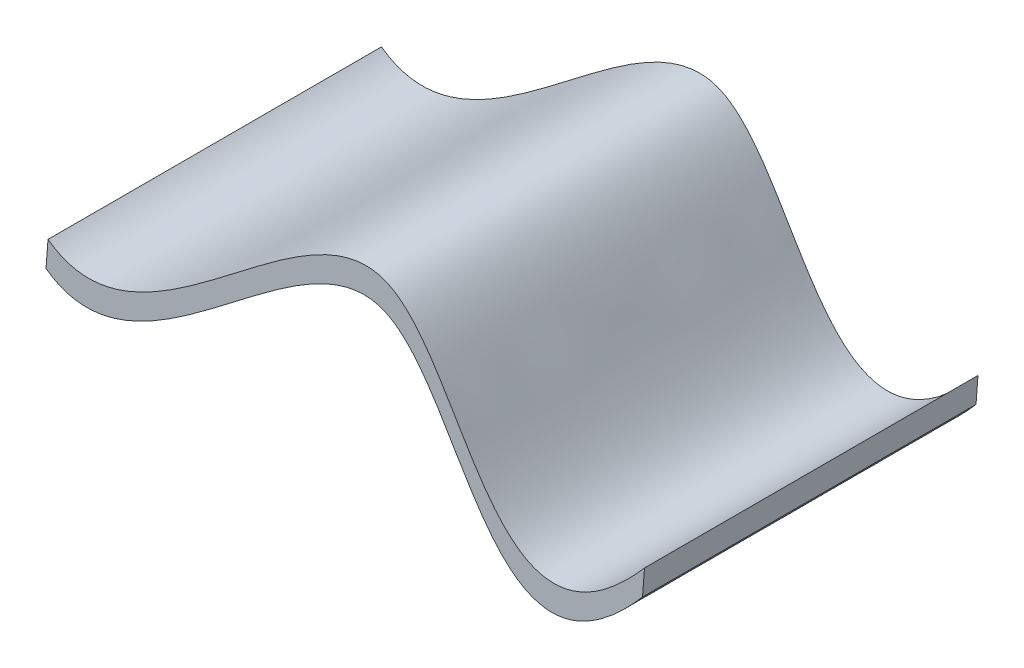
ISO-10303-21;
HEADER;
FILE_DESCRIPTION(('STEP AP214'),'2;1');
FILE_NAME('part.step','',(''),(''),'','','');
FILE_SCHEMA(('AUTOMOTIVE_DESIGN { 1 0 10303 214 1 1 1 1 }'));
ENDSEC;
DATA;
#1=APPLICATION_CONTEXT('core data for automotive mechanical design processes');
#2=APPLICATION_PROTOCOL_DEFINITION('international standard','automotive_design',2000,#1);
#3=PRODUCT_CONTEXT('',#1,'mechanical');
#4=PRODUCT('Part','Part','',(#3));
#5=PRODUCT_RELATED_PRODUCT_CATEGORY('part','',(#4));
#6=PRODUCT_DEFINITION_FORMATION('','',#4);
#7=PRODUCT_DEFINITION_CONTEXT('part definition',#1,'design');
#8=PRODUCT_DEFINITION('design','',#6,#7);
#9=PRODUCT_DEFINITION_SHAPE('','',#8);
#10=(LENGTH_UNIT() NAMED_UNIT(*) SI_UNIT(.MILLI.,.METRE.));
#11=(NAMED_UNIT(*) PLANE_ANGLE_UNIT() SI_UNIT($,.RADIAN.));
#12=(NAMED_UNIT(*) SI_UNIT($,.STERADIAN.) SOLID_ANGLE_UNIT());
#13=UNCERTAINTY_MEASURE_WITH_UNIT(LENGTH_MEASURE(1.E-05),#10,'distance_accuracy_value','');
#14=(GEOMETRIC_REPRESENTATION_CONTEXT(3) GLOBAL_UNCERTAINTY_ASSIGNED_CONTEXT((#13)) GLOBAL_UNIT_ASSIGNED_CONTEXT((#10,
#11,#12)) REPRESENTATION_CONTEXT('',''));
#15=CARTESIAN_POINT('',(0.,0.,0.));
#16=DIRECTION('',(0.,0.,1.));
#17=DIRECTION('',(1.,0.,0.));
#18=AXIS2_PLACEMENT_3D('',#15,#16,#17);
#19=CARTESIAN_POINT('',(106.155286508075,8.43825211030953,63.5));
#20=DIRECTION('',(0.,0.,-1.));
#21=DIRECTION('',(-1.,0.,0.));
#22=AXIS2_PLACEMENT_3D('',#19,#20,#21);
#23=PLANE('',#22);
#24=CARTESIAN_POINT('',(-121.768485531647,-6.76099698549761,63.5));
#25=CARTESIAN_POINT('',(-85.3038865842183,-33.6674468834601,63.5));
#26=CARTESIAN_POINT('',(26.6593206018398,140.113783309119,63.5));
#27=CARTESIAN_POINT('',(48.0306759334924,-67.9218428407147,63.5));
#28=CARTESIAN_POINT('',(105.395345512939,-1.53283056329772,63.5));
#29=B_SPLINE_CURVE_WITH_KNOTS('',3,(#24,#25,#26,#27,#28),.UNSPECIFIED.,.F.,.F.,(4,1,4),(0.,
0.51153537214387,1.),.UNSPECIFIED.);
#30=CARTESIAN_POINT('',(-121.768485531647,-6.76099698549761,63.5));
#31=VERTEX_POINT('',#30);
#32=CARTESIAN_POINT('',(105.395345512939,-1.53283056329772,63.5));
#33=VERTEX_POINT('',#32);
#34=EDGE_CURVE('E90',#31,#33,#29,.T.);
#35=ORIENTED_EDGE('',*,*,#34,.T.);
#36=DIRECTION('',(-0.0759940995136767,-0.997108267360724,0.));
#37=VECTOR('',#36,1.);
#38=CARTESIAN_POINT('',(106.155286508075,8.43825211030953,63.5));
#39=LINE('',#38,#37);
#40=CARTESIAN_POINT('',(106.155286508075,8.43825211030953,63.5));
#41=VERTEX_POINT('',#40);
#42=EDGE_CURVE('E78',#41,#33,#39,.T.);
#43=ORIENTED_EDGE('',*,*,#42,.F.);
#44=CARTESIAN_POINT('',(-121.00854453651,3.21008568810964,63.5));
#45=CARTESIAN_POINT('',(-84.5439455890816,-23.6963642098529,63.5));
#46=CARTESIAN_POINT('',(27.4192615969766,150.084865982726,63.5));
#47=CARTESIAN_POINT('',(48.7906169286291,-57.9507601671075,63.5));
#48=CARTESIAN_POINT('',(106.155286508075,8.43825211030953,63.5));
#49=B_SPLINE_CURVE_WITH_KNOTS('',3,(#44,#45,#46,#47,#48),.UNSPECIFIED.,.F.,.F.,(4,1,4),(0.,
0.51153537214387,1.),.UNSPECIFIED.);
#50=CARTESIAN_POINT('',(-121.00854453651,3.21008568810964,63.5));
#51=VERTEX_POINT('',#50);
#52=EDGE_CURVE('E93',#51,#41,#49,.T.);
#53=ORIENTED_EDGE('',*,*,#52,.F.);
#54=DIRECTION('',(-0.0759940995136767,-0.997108267360724,0.));
#55=VECTOR('',#54,1.);
#56=CARTESIAN_POINT('',(-121.00854453651,3.21008568810964,63.5));
#57=LINE('',#56,#55);
#58=EDGE_CURVE('E11',#51,#31,#57,.T.);
#59=ORIENTED_EDGE('',*,*,#58,.T.);
#60=EDGE_LOOP('',(#35,#43,#53,#59));
#61=FACE_BOUND('',#60,.T.);
#62=ADVANCED_FACE('F41',(#61),#23,.F.);
#63=CARTESIAN_POINT('',(-121.00854453651,3.21008568810964,-63.5));
#64=DIRECTION('',(0.997108267360724,-0.0759940995136767,0.));
#65=DIRECTION('',(0.0759940995136767,0.997108267360724,0.));
#66=AXIS2_PLACEMENT_3D('',#63,#64,#65);
#67=PLANE('',#66);
#68=DIRECTION('',(0.,0.,1.));
#69=VECTOR('',#68,1.);
#70=CARTESIAN_POINT('',(-121.768485531647,-6.76099698549761,-63.5));
#71=LINE('',#70,#69);
#72=CARTESIAN_POINT('',(-121.768485531647,-6.76099698549761,-63.5));
#73=VERTEX_POINT('',#72);
#74=EDGE_CURVE('E95',#73,#31,#71,.T.);
#75=ORIENTED_EDGE('',*,*,#74,.T.);
#76=ORIENTED_EDGE('',*,*,#58,.F.);
#77=DIRECTION('',(0.,0.,1.));
#78=VECTOR('',#77,1.);
#79=CARTESIAN_POINT('',(-121.00854453651,3.21008568810964,-63.5));
#80=LINE('',#79,#78);
#81=CARTESIAN_POINT('',(-121.00854453651,3.21008568810964,-63.5));
#82=VERTEX_POINT('',#81);
#83=EDGE_CURVE('E114',#82,#51,#80,.T.);
#84=ORIENTED_EDGE('',*,*,#83,.F.);
#85=DIRECTION('',(-0.0759940995136767,-0.997108267360724,0.));
#86=VECTOR('',#85,1.);
#87=CARTESIAN_POINT('',(-121.00854453651,3.21008568810964,-63.5));
#88=LINE('',#87,#86);
#89=EDGE_CURVE('E49',#82,#73,#88,.T.);
#90=ORIENTED_EDGE('',*,*,#89,.T.);
#91=EDGE_LOOP('',(#75,#76,#84,#90));
#92=FACE_BOUND('',#91,.T.);
#93=ADVANCED_FACE('F112',(#92),#67,.F.);
#94=CARTESIAN_POINT('',(106.155286508075,8.43825211030953,-63.5));
#95=DIRECTION('',(0.,0.,-1.));
#96=DIRECTION('',(-1.,0.,0.));
#97=AXIS2_PLACEMENT_3D('',#94,#95,#96);
#98=PLANE('',#97);
#99=CARTESIAN_POINT('',(-121.768485531647,-6.76099698549761,-63.5));
#100=CARTESIAN_POINT('',(-85.3038865842183,-33.6674468834601,-63.5));
#101=CARTESIAN_POINT('',(26.6593206018398,140.113783309119,-63.5));
#102=CARTESIAN_POINT('',(48.0306759334924,-67.9218428407147,-63.5));
#103=CARTESIAN_POINT('',(105.395345512939,-1.53283056329772,-63.5));
#104=B_SPLINE_CURVE_WITH_KNOTS('',3,(#99,#100,#101,#102,#103),.UNSPECIFIED.,.F.,.F.,(4,1,4),(0.,
0.51153537214387,1.),.UNSPECIFIED.);
#105=CARTESIAN_POINT('',(105.395345512939,-1.53283056329772,-63.5));
#106=VERTEX_POINT('',#105);
#107=EDGE_CURVE('E92',#73,#106,#104,.T.);
#108=ORIENTED_EDGE('',*,*,#107,.F.);
#109=ORIENTED_EDGE('',*,*,#89,.F.);
#110=CARTESIAN_POINT('',(-121.00854453651,3.21008568810964,-63.5));
#111=CARTESIAN_POINT('',(-84.5439455890816,-23.6963642098529,-63.5));
#112=CARTESIAN_POINT('',(27.4192615969766,150.084865982726,-63.5));
#113=CARTESIAN_POINT('',(48.7906169286291,-57.9507601671075,-63.5));
#114=CARTESIAN_POINT('',(106.155286508075,8.43825211030953,-63.5));
#115=B_SPLINE_CURVE_WITH_KNOTS('',3,(#110,#111,#112,#113,#114),.UNSPECIFIED.,.F.,.F.,(4,1,4),
(0.,0.51153537214387,1.),.UNSPECIFIED.);
#116=CARTESIAN_POINT('',(106.155286508075,8.43825211030953,-63.5));
#117=VERTEX_POINT('',#116);
#118=EDGE_CURVE('E118',#82,#117,#115,.T.);
#119=ORIENTED_EDGE('',*,*,#118,.T.);
#120=DIRECTION('',(-0.0759940995136767,-0.997108267360724,0.));
#121=VECTOR('',#120,1.);
#122=CARTESIAN_POINT('',(106.155286508075,8.43825211030953,-63.5));
#123=LINE('',#122,#121);
#124=EDGE_CURVE('E57',#117,#106,#123,.T.);
#125=ORIENTED_EDGE('',*,*,#124,.T.);
#126=EDGE_LOOP('',(#108,#109,#119,#125));
#127=FACE_BOUND('',#126,.T.);
#128=ADVANCED_FACE('F117',(#127),#98,.T.);
#129=CARTESIAN_POINT('',(106.155286508075,8.43825211030953,-63.5));
#130=DIRECTION('',(0.997108267360724,-0.0759940995136767,0.));
#131=DIRECTION('',(0.0759940995136767,0.997108267360724,0.));
#132=AXIS2_PLACEMENT_3D('',#129,#130,#131);
#133=PLANE('',#132);
#134=DIRECTION('',(0.,0.,1.));
#135=VECTOR('',#134,1.);
#136=CARTESIAN_POINT('',(105.395345512939,-1.53283056329772,-63.5));
#137=LINE('',#136,#135);
#138=EDGE_CURVE('E81',#106,#33,#137,.T.);
#139=ORIENTED_EDGE('',*,*,#138,.F.);
#140=ORIENTED_EDGE('',*,*,#124,.F.);
#141=DIRECTION('',(0.,0.,1.));
#142=VECTOR('',#141,1.);
#143=CARTESIAN_POINT('',(106.155286508075,8.43825211030953,-63.5));
#144=LINE('',#143,#142);
#145=EDGE_CURVE('E84',#117,#41,#144,.T.);
#146=ORIENTED_EDGE('',*,*,#145,.T.);
#147=ORIENTED_EDGE('',*,*,#42,.T.);
#148=EDGE_LOOP('',(#139,#140,#146,#147));
#149=FACE_BOUND('',#148,.T.);
#150=ADVANCED_FACE('F80',(#149),#133,.T.);
#151=DIRECTION('',(0.,0.,1.));
#152=VECTOR('',#151,1.);
#153=SURFACE_OF_LINEAR_EXTRUSION('',#115,#152);
#154=ORIENTED_EDGE('',*,*,#52,.T.);
#155=ORIENTED_EDGE('',*,*,#145,.F.);
#156=ORIENTED_EDGE('',*,*,#118,.F.);
#157=ORIENTED_EDGE('',*,*,#83,.T.);
#158=EDGE_LOOP('',(#154,#155,#156,#157));
#159=FACE_BOUND('',#158,.T.);
#160=ADVANCED_FACE('F121',(#159),#153,.F.);
#161=DIRECTION('',(0.,0.,1.));
#162=VECTOR('',#161,1.);
#163=SURFACE_OF_LINEAR_EXTRUSION('',#104,#162);
#164=ORIENTED_EDGE('',*,*,#34,.F.);
#165=ORIENTED_EDGE('',*,*,#74,.F.);
#166=ORIENTED_EDGE('',*,*,#107,.T.);
#167=ORIENTED_EDGE('',*,*,#138,.T.);
#168=EDGE_LOOP('',(#164,#165,#166,#167));
#169=FACE_BOUND('',#168,.T.);
#170=ADVANCED_FACE('F88',(#169),#163,.T.);
#171=CLOSED_SHELL('',(#62,#93,#128,#150,#160,#170));
#172=MANIFOLD_SOLID_BREP('B2',#171);
#173=ADVANCED_BREP_SHAPE_REPRESENTATION('',(#18,#172),#14);
#174=SHAPE_DEFINITION_REPRESENTATION(#9,#173);
ENDSEC;
END-ISO-10303-21;
